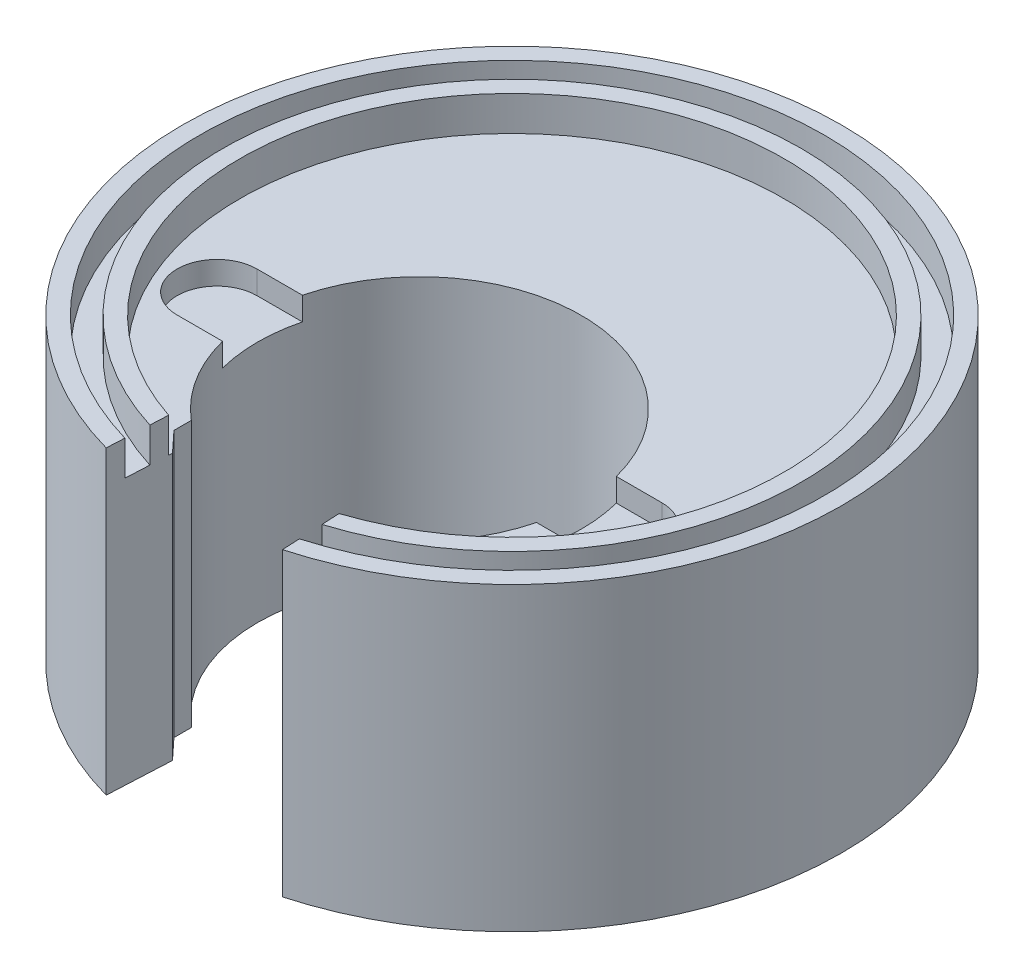
ISO-10303-21;
HEADER;
FILE_DESCRIPTION(('STEP AP214'),'2;1');
FILE_NAME('part.step','',(''),(''),'','','');
FILE_SCHEMA(('AUTOMOTIVE_DESIGN { 1 0 10303 214 1 1 1 1 }'));
ENDSEC;
DATA;
#1=APPLICATION_CONTEXT('core data for automotive mechanical design processes');
#2=APPLICATION_PROTOCOL_DEFINITION('international standard','automotive_design',2000,#1);
#3=PRODUCT_CONTEXT('',#1,'mechanical');
#4=PRODUCT('Part','Part','',(#3));
#5=PRODUCT_RELATED_PRODUCT_CATEGORY('part','',(#4));
#6=PRODUCT_DEFINITION_FORMATION('','',#4);
#7=PRODUCT_DEFINITION_CONTEXT('part definition',#1,'design');
#8=PRODUCT_DEFINITION('design','',#6,#7);
#9=PRODUCT_DEFINITION_SHAPE('','',#8);
#10=(LENGTH_UNIT() NAMED_UNIT(*) SI_UNIT(.MILLI.,.METRE.));
#11=(NAMED_UNIT(*) PLANE_ANGLE_UNIT() SI_UNIT($,.RADIAN.));
#12=(NAMED_UNIT(*) SI_UNIT($,.STERADIAN.) SOLID_ANGLE_UNIT());
#13=UNCERTAINTY_MEASURE_WITH_UNIT(LENGTH_MEASURE(1.E-05),#10,'distance_accuracy_value','');
#14=(GEOMETRIC_REPRESENTATION_CONTEXT(3) GLOBAL_UNCERTAINTY_ASSIGNED_CONTEXT((#13)) GLOBAL_UNIT_ASSIGNED_CONTEXT((#10,
#11,#12)) REPRESENTATION_CONTEXT('',''));
#15=CARTESIAN_POINT('',(0.,0.,0.));
#16=DIRECTION('',(0.,0.,1.));
#17=DIRECTION('',(1.,0.,0.));
#18=AXIS2_PLACEMENT_3D('',#15,#16,#17);
#19=CARTESIAN_POINT('',(0.,23.,0.));
#20=DIRECTION('',(0.,1.,0.));
#21=DIRECTION('',(0.,0.,1.));
#22=AXIS2_PLACEMENT_3D('',#19,#20,#21);
#23=PLANE('',#22);
#24=DIRECTION('',(1.,0.,0.));
#25=VECTOR('',#24,1.);
#26=CARTESIAN_POINT('',(-17.5,23.,11.45));
#27=LINE('',#26,#25);
#28=CARTESIAN_POINT('',(-17.5,23.,11.45));
#29=VERTEX_POINT('',#28);
#30=CARTESIAN_POINT('',(-13.5682533879641,23.,11.45));
#31=VERTEX_POINT('',#30);
#32=EDGE_CURVE('E401',#29,#31,#27,.T.);
#33=ORIENTED_EDGE('',*,*,#32,.F.);
#34=CARTESIAN_POINT('',(-17.5,23.,7.99999999999999));
#35=DIRECTION('',(0.,1.,0.));
#36=DIRECTION('',(0.,0.,1.));
#37=AXIS2_PLACEMENT_3D('',#34,#35,#36);
#38=CIRCLE('',#37,3.45);
#39=CARTESIAN_POINT('',(-17.5,23.,4.54999999999999));
#40=VERTEX_POINT('',#39);
#41=EDGE_CURVE('E404',#40,#29,#38,.T.);
#42=ORIENTED_EDGE('',*,*,#41,.F.);
#43=DIRECTION('',(-1.,0.,0.));
#44=VECTOR('',#43,1.);
#45=CARTESIAN_POINT('',(-13.5682533879641,23.,4.55));
#46=LINE('',#45,#44);
#47=CARTESIAN_POINT('',(-13.5682533879641,23.,4.55));
#48=VERTEX_POINT('',#47);
#49=EDGE_CURVE('E407',#48,#40,#46,.T.);
#50=ORIENTED_EDGE('',*,*,#49,.F.);
#51=CARTESIAN_POINT('',(0.,23.,8.));
#52=DIRECTION('',(0.,1.,0.));
#53=DIRECTION('',(0.,0.,1.));
#54=AXIS2_PLACEMENT_3D('',#51,#52,#53);
#55=CIRCLE('',#54,14.);
#56=CARTESIAN_POINT('',(13.5682533879641,23.,4.55));
#57=VERTEX_POINT('',#56);
#58=EDGE_CURVE('E347',#57,#48,#55,.T.);
#59=ORIENTED_EDGE('',*,*,#58,.F.);
#60=DIRECTION('',(-1.,0.,0.));
#61=VECTOR('',#60,1.);
#62=CARTESIAN_POINT('',(17.5,23.,4.55));
#63=LINE('',#62,#61);
#64=CARTESIAN_POINT('',(17.5,23.,4.55));
#65=VERTEX_POINT('',#64);
#66=EDGE_CURVE('E410',#65,#57,#63,.T.);
#67=ORIENTED_EDGE('',*,*,#66,.F.);
#68=CARTESIAN_POINT('',(17.5,23.,8.));
#69=DIRECTION('',(0.,1.,0.));
#70=DIRECTION('',(0.,0.,1.));
#71=AXIS2_PLACEMENT_3D('',#68,#69,#70);
#72=CIRCLE('',#71,3.45);
#73=CARTESIAN_POINT('',(17.5,23.,11.45));
#74=VERTEX_POINT('',#73);
#75=EDGE_CURVE('E412',#74,#65,#72,.T.);
#76=ORIENTED_EDGE('',*,*,#75,.F.);
#77=DIRECTION('',(1.,0.,0.));
#78=VECTOR('',#77,1.);
#79=CARTESIAN_POINT('',(13.5682533879641,23.,11.45));
#80=LINE('',#79,#78);
#81=CARTESIAN_POINT('',(13.5682533879641,23.,11.45));
#82=VERTEX_POINT('',#81);
#83=EDGE_CURVE('E415',#82,#74,#80,.T.);
#84=ORIENTED_EDGE('',*,*,#83,.F.);
#85=CARTESIAN_POINT('',(8.99999999999999,23.,18.7238052947636));
#86=VERTEX_POINT('',#85);
#87=EDGE_CURVE('E345',#86,#82,#55,.T.);
#88=ORIENTED_EDGE('',*,*,#87,.F.);
#89=DIRECTION('',(0.,0.,-1.));
#90=VECTOR('',#89,1.);
#91=CARTESIAN_POINT('',(8.99999999999999,23.,0.));
#92=LINE('',#91,#90);
#93=CARTESIAN_POINT('',(8.99999999999999,23.,20.2238052947636));
#94=VERTEX_POINT('',#93);
#95=EDGE_CURVE('E267',#94,#86,#92,.T.);
#96=ORIENTED_EDGE('',*,*,#95,.F.);
#97=DIRECTION('',(0.68060089492241,0.,-0.732654367236568));
#98=VECTOR('',#97,1.);
#99=CARTESIAN_POINT('',(14.9155455966769,23.,13.8558290720957));
#100=LINE('',#99,#98);
#101=CARTESIAN_POINT('',(7.34999999999999,23.,22.));
#102=VERTEX_POINT('',#101);
#103=EDGE_CURVE('E260',#102,#94,#100,.T.);
#104=ORIENTED_EDGE('',*,*,#103,.F.);
#105=DIRECTION('',(-0.048863968169108,0.,-0.998805442823961));
#106=VECTOR('',#105,1.);
#107=CARTESIAN_POINT('',(6.25872735568234,23.,-0.306192018159726));
#108=LINE('',#107,#106);
#109=CARTESIAN_POINT('',(7.36545532881279,23.,22.3159151235002));
#110=VERTEX_POINT('',#109);
#111=EDGE_CURVE('E350',#110,#102,#108,.T.);
#112=ORIENTED_EDGE('',*,*,#111,.F.);
#113=CARTESIAN_POINT('',(0.,23.,0.));
#114=DIRECTION('',(0.,1.,0.));
#115=DIRECTION('',(0.,0.,1.));
#116=AXIS2_PLACEMENT_3D('',#113,#114,#115);
#117=CIRCLE('',#116,23.5);
#118=CARTESIAN_POINT('',(-7.36545532881278,23.,22.3159151235002));
#119=VERTEX_POINT('',#118);
#120=EDGE_CURVE('E323',#110,#119,#117,.T.);
#121=ORIENTED_EDGE('',*,*,#120,.T.);
#122=DIRECTION('',(-0.048863968169108,0.,0.998805442823961));
#123=VECTOR('',#122,1.);
#124=CARTESIAN_POINT('',(-6.25872735568234,23.,-0.306192018159726));
#125=LINE('',#124,#123);
#126=CARTESIAN_POINT('',(-7.34999999999999,23.,22.));
#127=VERTEX_POINT('',#126);
#128=EDGE_CURVE('E354',#127,#119,#125,.T.);
#129=ORIENTED_EDGE('',*,*,#128,.F.);
#130=DIRECTION('',(0.680600894922409,0.,0.732654367236568));
#131=VECTOR('',#130,1.);
#132=CARTESIAN_POINT('',(-14.9155455966769,23.,13.8558290720957));
#133=LINE('',#132,#131);
#134=CARTESIAN_POINT('',(-8.99999999999999,23.,20.2238052947636));
#135=VERTEX_POINT('',#134);
#136=EDGE_CURVE('E278',#135,#127,#133,.T.);
#137=ORIENTED_EDGE('',*,*,#136,.F.);
#138=DIRECTION('',(0.,0.,1.));
#139=VECTOR('',#138,1.);
#140=CARTESIAN_POINT('',(-8.99999999999999,23.,0.));
#141=LINE('',#140,#139);
#142=CARTESIAN_POINT('',(-8.99999999999999,23.,18.7238052947636));
#143=VERTEX_POINT('',#142);
#144=EDGE_CURVE('E223',#143,#135,#141,.T.);
#145=ORIENTED_EDGE('',*,*,#144,.F.);
#146=EDGE_CURVE('E276',#31,#143,#55,.T.);
#147=ORIENTED_EDGE('',*,*,#146,.F.);
#148=EDGE_LOOP('',(#33,#42,#50,#59,#67,#76,#84,#88,#96,#104,#112,#121,#129,#137,#145,#147));
#149=FACE_BOUND('',#148,.T.);
#150=ADVANCED_FACE('F64',(#149),#23,.T.);
#151=CARTESIAN_POINT('',(0.,3.,0.));
#152=DIRECTION('',(0.,-1.,0.));
#153=DIRECTION('',(0.,0.,-1.));
#154=AXIS2_PLACEMENT_3D('',#151,#152,#153);
#155=CYLINDRICAL_SURFACE('',#154,28.5);
#156=DIRECTION('',(0.,-1.,0.));
#157=VECTOR('',#156,1.);
#158=CARTESIAN_POINT('',(7.61727272727272,23.,27.4631963944175));
#159=LINE('',#158,#157);
#160=CARTESIAN_POINT('',(7.61727272727272,26.,27.4631963944175));
#161=VERTEX_POINT('',#160);
#162=CARTESIAN_POINT('',(7.61727272727272,0.,27.4631963944175));
#163=VERTEX_POINT('',#162);
#164=EDGE_CURVE('E285',#161,#163,#159,.T.);
#165=ORIENTED_EDGE('',*,*,#164,.T.);
#166=CARTESIAN_POINT('',(0.,0.,0.));
#167=DIRECTION('',(0.,1.,0.));
#168=DIRECTION('',(0.,0.,1.));
#169=AXIS2_PLACEMENT_3D('',#166,#167,#168);
#170=CIRCLE('',#169,28.5);
#171=CARTESIAN_POINT('',(-7.61727272727272,0.,27.4631963944175));
#172=VERTEX_POINT('',#171);
#173=EDGE_CURVE('E237',#163,#172,#170,.T.);
#174=ORIENTED_EDGE('',*,*,#173,.T.);
#175=DIRECTION('',(0.,-1.,0.));
#176=VECTOR('',#175,1.);
#177=CARTESIAN_POINT('',(-7.61727272727272,23.,27.4631963944175));
#178=LINE('',#177,#176);
#179=CARTESIAN_POINT('',(-7.61727272727272,26.,27.4631963944175));
#180=VERTEX_POINT('',#179);
#181=EDGE_CURVE('E283',#180,#172,#178,.T.);
#182=ORIENTED_EDGE('',*,*,#181,.F.);
#183=CARTESIAN_POINT('',(0.,26.,0.));
#184=DIRECTION('',(0.,1.,0.));
#185=DIRECTION('',(0.,0.,1.));
#186=AXIS2_PLACEMENT_3D('',#183,#184,#185);
#187=CIRCLE('',#186,28.5);
#188=EDGE_CURVE('E304',#161,#180,#187,.T.);
#189=ORIENTED_EDGE('',*,*,#188,.F.);
#190=EDGE_LOOP('',(#165,#174,#182,#189));
#191=FACE_BOUND('',#190,.T.);
#192=ADVANCED_FACE('F66',(#191),#155,.T.);
#193=CARTESIAN_POINT('',(0.,0.,0.));
#194=DIRECTION('',(0.,1.,0.));
#195=DIRECTION('',(0.,0.,1.));
#196=AXIS2_PLACEMENT_3D('',#193,#194,#195);
#197=PLANE('',#196);
#198=ORIENTED_EDGE('',*,*,#173,.F.);
#199=DIRECTION('',(-0.0488639681691075,0.,-0.998805442823961));
#200=VECTOR('',#199,1.);
#201=CARTESIAN_POINT('',(6.25872735568235,0.,-0.306192018159723));
#202=LINE('',#201,#200);
#203=CARTESIAN_POINT('',(7.34999999999999,0.,22.));
#204=VERTEX_POINT('',#203);
#205=EDGE_CURVE('E12',#163,#204,#202,.T.);
#206=ORIENTED_EDGE('',*,*,#205,.T.);
#207=DIRECTION('',(0.68060089492241,0.,-0.732654367236567));
#208=VECTOR('',#207,1.);
#209=CARTESIAN_POINT('',(14.9155455966769,0.,13.8558290720957));
#210=LINE('',#209,#208);
#211=CARTESIAN_POINT('',(8.99999999999999,0.,20.2238052947636));
#212=VERTEX_POINT('',#211);
#213=EDGE_CURVE('E72',#204,#212,#210,.T.);
#214=ORIENTED_EDGE('',*,*,#213,.T.);
#215=DIRECTION('',(0.,0.,-1.));
#216=VECTOR('',#215,1.);
#217=CARTESIAN_POINT('',(8.99999999999999,0.,0.));
#218=LINE('',#217,#216);
#219=CARTESIAN_POINT('',(8.99999999999999,0.,18.7238052947636));
#220=VERTEX_POINT('',#219);
#221=EDGE_CURVE('E245',#212,#220,#218,.T.);
#222=ORIENTED_EDGE('',*,*,#221,.T.);
#223=CARTESIAN_POINT('',(0.,0.,8.));
#224=DIRECTION('',(0.,1.,0.));
#225=DIRECTION('',(0.,0.,1.));
#226=AXIS2_PLACEMENT_3D('',#223,#224,#225);
#227=CIRCLE('',#226,14.);
#228=CARTESIAN_POINT('',(-9.,0.,18.7238052947636));
#229=VERTEX_POINT('',#228);
#230=EDGE_CURVE('E243',#220,#229,#227,.T.);
#231=ORIENTED_EDGE('',*,*,#230,.T.);
#232=DIRECTION('',(0.,0.,1.));
#233=VECTOR('',#232,1.);
#234=CARTESIAN_POINT('',(-9.00000000000001,0.,0.));
#235=LINE('',#234,#233);
#236=CARTESIAN_POINT('',(-8.99999999999999,0.,20.2238052947636));
#237=VERTEX_POINT('',#236);
#238=EDGE_CURVE('E220',#229,#237,#235,.T.);
#239=ORIENTED_EDGE('',*,*,#238,.T.);
#240=DIRECTION('',(0.680600894922408,0.,0.732654367236569));
#241=VECTOR('',#240,1.);
#242=CARTESIAN_POINT('',(-14.9155455966769,0.,13.8558290720957));
#243=LINE('',#242,#241);
#244=CARTESIAN_POINT('',(-7.34999999999999,0.,22.));
#245=VERTEX_POINT('',#244);
#246=EDGE_CURVE('E231',#237,#245,#243,.T.);
#247=ORIENTED_EDGE('',*,*,#246,.T.);
#248=DIRECTION('',(-0.0488639681691076,0.,0.998805442823961));
#249=VECTOR('',#248,1.);
#250=CARTESIAN_POINT('',(-6.25872735568235,0.,-0.306192018159724));
#251=LINE('',#250,#249);
#252=EDGE_CURVE('E236',#245,#172,#251,.T.);
#253=ORIENTED_EDGE('',*,*,#252,.T.);
#254=EDGE_LOOP('',(#198,#206,#214,#222,#231,#239,#247,#253));
#255=FACE_BOUND('',#254,.T.);
#256=ADVANCED_FACE('F240',(#255),#197,.F.);
#257=CARTESIAN_POINT('',(0.,23.,8.));
#258=DIRECTION('',(0.,-1.,0.));
#259=DIRECTION('',(0.,0.,-1.));
#260=AXIS2_PLACEMENT_3D('',#257,#258,#259);
#261=CYLINDRICAL_SURFACE('',#260,14.);
#262=DIRECTION('',(0.,1.,0.));
#263=VECTOR('',#262,1.);
#264=CARTESIAN_POINT('',(13.5682533879641,21.,11.45));
#265=LINE('',#264,#263);
#266=CARTESIAN_POINT('',(13.5682533879641,21.,11.45));
#267=VERTEX_POINT('',#266);
#268=EDGE_CURVE('E385',#267,#82,#265,.T.);
#269=ORIENTED_EDGE('',*,*,#268,.F.);
#270=CARTESIAN_POINT('',(0.,21.,8.));
#271=DIRECTION('',(0.,1.,0.));
#272=DIRECTION('',(0.,0.,1.));
#273=AXIS2_PLACEMENT_3D('',#270,#271,#272);
#274=CIRCLE('',#273,14.);
#275=CARTESIAN_POINT('',(13.5682533879641,21.,4.55));
#276=VERTEX_POINT('',#275);
#277=EDGE_CURVE('E315',#267,#276,#274,.T.);
#278=ORIENTED_EDGE('',*,*,#277,.T.);
#279=DIRECTION('',(0.,1.,0.));
#280=VECTOR('',#279,1.);
#281=CARTESIAN_POINT('',(13.5682533879641,21.,4.55));
#282=LINE('',#281,#280);
#283=EDGE_CURVE('E391',#276,#57,#282,.T.);
#284=ORIENTED_EDGE('',*,*,#283,.T.);
#285=ORIENTED_EDGE('',*,*,#58,.T.);
#286=DIRECTION('',(0.,1.,0.));
#287=VECTOR('',#286,1.);
#288=CARTESIAN_POINT('',(-13.5682533879641,21.,4.55));
#289=LINE('',#288,#287);
#290=CARTESIAN_POINT('',(-13.5682533879641,21.,4.55));
#291=VERTEX_POINT('',#290);
#292=EDGE_CURVE('E394',#291,#48,#289,.T.);
#293=ORIENTED_EDGE('',*,*,#292,.F.);
#294=CARTESIAN_POINT('',(-13.5682533879641,21.,11.45));
#295=VERTEX_POINT('',#294);
#296=EDGE_CURVE('E381',#291,#295,#274,.T.);
#297=ORIENTED_EDGE('',*,*,#296,.T.);
#298=DIRECTION('',(0.,1.,0.));
#299=VECTOR('',#298,1.);
#300=CARTESIAN_POINT('',(-13.5682533879641,21.,11.45));
#301=LINE('',#300,#299);
#302=EDGE_CURVE('E384',#295,#31,#301,.T.);
#303=ORIENTED_EDGE('',*,*,#302,.T.);
#304=ORIENTED_EDGE('',*,*,#146,.T.);
#305=DIRECTION('',(0.,-1.,0.));
#306=VECTOR('',#305,1.);
#307=CARTESIAN_POINT('',(-8.99999999999999,23.,18.7238052947636));
#308=LINE('',#307,#306);
#309=EDGE_CURVE('E228',#143,#229,#308,.T.);
#310=ORIENTED_EDGE('',*,*,#309,.T.);
#311=ORIENTED_EDGE('',*,*,#230,.F.);
#312=DIRECTION('',(0.,-1.,0.));
#313=VECTOR('',#312,1.);
#314=CARTESIAN_POINT('',(8.99999999999999,23.,18.7238052947636));
#315=LINE('',#314,#313);
#316=EDGE_CURVE('E264',#86,#220,#315,.T.);
#317=ORIENTED_EDGE('',*,*,#316,.F.);
#318=ORIENTED_EDGE('',*,*,#87,.T.);
#319=EDGE_LOOP('',(#269,#278,#284,#285,#293,#297,#303,#304,#310,#311,#317,#318));
#320=FACE_BOUND('',#319,.T.);
#321=ADVANCED_FACE('F273',(#320),#261,.F.);
#322=CARTESIAN_POINT('',(8.99999999999999,23.,0.));
#323=DIRECTION('',(-1.,0.,0.));
#324=DIRECTION('',(0.,0.,1.));
#325=AXIS2_PLACEMENT_3D('',#322,#323,#324);
#326=PLANE('',#325);
#327=ORIENTED_EDGE('',*,*,#316,.T.);
#328=ORIENTED_EDGE('',*,*,#221,.F.);
#329=DIRECTION('',(0.,-1.,0.));
#330=VECTOR('',#329,1.);
#331=CARTESIAN_POINT('',(8.99999999999999,23.,20.2238052947636));
#332=LINE('',#331,#330);
#333=EDGE_CURVE('E259',#94,#212,#332,.T.);
#334=ORIENTED_EDGE('',*,*,#333,.F.);
#335=ORIENTED_EDGE('',*,*,#95,.T.);
#336=EDGE_LOOP('',(#327,#328,#334,#335));
#337=FACE_BOUND('',#336,.T.);
#338=ADVANCED_FACE('F266',(#337),#326,.T.);
#339=CARTESIAN_POINT('',(14.9155455966769,23.,13.8558290720957));
#340=DIRECTION('',(-0.732654367236568,0.,-0.68060089492241));
#341=DIRECTION('',(-0.68060089492241,0.,0.732654367236568));
#342=AXIS2_PLACEMENT_3D('',#339,#340,#341);
#343=PLANE('',#342);
#344=ORIENTED_EDGE('',*,*,#333,.T.);
#345=ORIENTED_EDGE('',*,*,#213,.F.);
#346=DIRECTION('',(0.,-1.,0.));
#347=VECTOR('',#346,1.);
#348=CARTESIAN_POINT('',(7.34999999999999,23.,22.));
#349=LINE('',#348,#347);
#350=EDGE_CURVE('E257',#102,#204,#349,.T.);
#351=ORIENTED_EDGE('',*,*,#350,.F.);
#352=ORIENTED_EDGE('',*,*,#103,.T.);
#353=EDGE_LOOP('',(#344,#345,#351,#352));
#354=FACE_BOUND('',#353,.T.);
#355=ADVANCED_FACE('F255',(#354),#343,.T.);
#356=CARTESIAN_POINT('',(6.25872735568234,23.,-0.306192018159726));
#357=DIRECTION('',(-0.998805442823961,0.,0.048863968169108));
#358=DIRECTION('',(0.048863968169108,0.,0.998805442823961));
#359=AXIS2_PLACEMENT_3D('',#356,#357,#358);
#360=PLANE('',#359);
#361=ORIENTED_EDGE('',*,*,#350,.T.);
#362=ORIENTED_EDGE('',*,*,#205,.F.);
#363=ORIENTED_EDGE('',*,*,#164,.F.);
#364=DIRECTION('',(0.048863968169108,0.,0.998805442823961));
#365=VECTOR('',#364,1.);
#366=CARTESIAN_POINT('',(6.25872735568234,26.,-0.306192018159726));
#367=LINE('',#366,#365);
#368=CARTESIAN_POINT('',(7.54203189936989,26.,25.9252339397138));
#369=VERTEX_POINT('',#368);
#370=EDGE_CURVE('E308',#369,#161,#367,.T.);
#371=ORIENTED_EDGE('',*,*,#370,.F.);
#372=DIRECTION('',(0.,-1.,0.));
#373=VECTOR('',#372,1.);
#374=CARTESIAN_POINT('',(7.54203189936989,26.,25.9252339397138));
#375=LINE('',#374,#373);
#376=CARTESIAN_POINT('',(7.54203189936989,23.,25.9252339397138));
#377=VERTEX_POINT('',#376);
#378=EDGE_CURVE('E306',#369,#377,#375,.T.);
#379=ORIENTED_EDGE('',*,*,#378,.T.);
#380=CARTESIAN_POINT('',(7.44133086649441,23.,23.8668513829403));
#381=VERTEX_POINT('',#380);
#382=EDGE_CURVE('E351',#377,#381,#108,.T.);
#383=ORIENTED_EDGE('',*,*,#382,.T.);
#384=DIRECTION('',(0.,-1.,0.));
#385=VECTOR('',#384,1.);
#386=CARTESIAN_POINT('',(7.4413308664944,26.,23.8668513829403));
#387=LINE('',#386,#385);
#388=CARTESIAN_POINT('',(7.4413308664944,26.,23.8668513829403));
#389=VERTEX_POINT('',#388);
#390=EDGE_CURVE('E342',#389,#381,#387,.T.);
#391=ORIENTED_EDGE('',*,*,#390,.F.);
#392=DIRECTION('',(0.048863968169108,0.,0.998805442823961));
#393=VECTOR('',#392,1.);
#394=CARTESIAN_POINT('',(6.25872735568234,26.,-0.306192018159726));
#395=LINE('',#394,#393);
#396=CARTESIAN_POINT('',(7.36545532881278,26.,22.3159151235002));
#397=VERTEX_POINT('',#396);
#398=EDGE_CURVE('E319',#397,#389,#395,.T.);
#399=ORIENTED_EDGE('',*,*,#398,.F.);
#400=DIRECTION('',(0.,-1.,0.));
#401=VECTOR('',#400,1.);
#402=CARTESIAN_POINT('',(7.36545532881278,26.,22.3159151235002));
#403=LINE('',#402,#401);
#404=EDGE_CURVE('E330',#397,#110,#403,.T.);
#405=ORIENTED_EDGE('',*,*,#404,.T.);
#406=ORIENTED_EDGE('',*,*,#111,.T.);
#407=EDGE_LOOP('',(#361,#362,#363,#371,#379,#383,#391,#399,#405,#406));
#408=FACE_BOUND('',#407,.T.);
#409=ADVANCED_FACE('F483',(#408),#360,.T.);
#410=CARTESIAN_POINT('',(-6.25872735568234,23.,-0.306192018159726));
#411=DIRECTION('',(0.998805442823961,0.,0.048863968169108));
#412=DIRECTION('',(0.048863968169108,0.,-0.998805442823961));
#413=AXIS2_PLACEMENT_3D('',#410,#411,#412);
#414=PLANE('',#413);
#415=ORIENTED_EDGE('',*,*,#181,.T.);
#416=ORIENTED_EDGE('',*,*,#252,.F.);
#417=DIRECTION('',(0.,-1.,0.));
#418=VECTOR('',#417,1.);
#419=CARTESIAN_POINT('',(-7.34999999999999,23.,22.));
#420=LINE('',#419,#418);
#421=EDGE_CURVE('E227',#127,#245,#420,.T.);
#422=ORIENTED_EDGE('',*,*,#421,.F.);
#423=ORIENTED_EDGE('',*,*,#128,.T.);
#424=DIRECTION('',(0.,-1.,0.));
#425=VECTOR('',#424,1.);
#426=CARTESIAN_POINT('',(-7.36545532881278,26.,22.3159151235002));
#427=LINE('',#426,#425);
#428=CARTESIAN_POINT('',(-7.36545532881278,26.,22.3159151235002));
#429=VERTEX_POINT('',#428);
#430=EDGE_CURVE('E336',#429,#119,#427,.T.);
#431=ORIENTED_EDGE('',*,*,#430,.F.);
#432=DIRECTION('',(0.048863968169108,0.,-0.998805442823961));
#433=VECTOR('',#432,1.);
#434=CARTESIAN_POINT('',(-6.25872735568234,26.,-0.306192018159726));
#435=LINE('',#434,#433);
#436=CARTESIAN_POINT('',(-7.4413308664944,26.,23.8668513829403));
#437=VERTEX_POINT('',#436);
#438=EDGE_CURVE('E325',#437,#429,#435,.T.);
#439=ORIENTED_EDGE('',*,*,#438,.F.);
#440=DIRECTION('',(0.,-1.,0.));
#441=VECTOR('',#440,1.);
#442=CARTESIAN_POINT('',(-7.4413308664944,26.,23.8668513829403));
#443=LINE('',#442,#441);
#444=CARTESIAN_POINT('',(-7.4413308664944,23.,23.8668513829403));
#445=VERTEX_POINT('',#444);
#446=EDGE_CURVE('E339',#437,#445,#443,.T.);
#447=ORIENTED_EDGE('',*,*,#446,.T.);
#448=CARTESIAN_POINT('',(-7.54203189936989,23.,25.9252339397138));
#449=VERTEX_POINT('',#448);
#450=EDGE_CURVE('E353',#445,#449,#125,.T.);
#451=ORIENTED_EDGE('',*,*,#450,.T.);
#452=DIRECTION('',(0.,-1.,0.));
#453=VECTOR('',#452,1.);
#454=CARTESIAN_POINT('',(-7.54203189936989,26.,25.9252339397138));
#455=LINE('',#454,#453);
#456=CARTESIAN_POINT('',(-7.54203189936989,26.,25.9252339397138));
#457=VERTEX_POINT('',#456);
#458=EDGE_CURVE('E300',#457,#449,#455,.T.);
#459=ORIENTED_EDGE('',*,*,#458,.F.);
#460=DIRECTION('',(0.048863968169108,0.,-0.998805442823961));
#461=VECTOR('',#460,1.);
#462=CARTESIAN_POINT('',(-6.25872735568234,26.,-0.306192018159726));
#463=LINE('',#462,#461);
#464=EDGE_CURVE('E298',#180,#457,#463,.T.);
#465=ORIENTED_EDGE('',*,*,#464,.F.);
#466=EDGE_LOOP('',(#415,#416,#422,#423,#431,#439,#447,#451,#459,#465));
#467=FACE_BOUND('',#466,.T.);
#468=ADVANCED_FACE('F293',(#467),#414,.T.);
#469=CARTESIAN_POINT('',(-14.9155455966769,23.,13.8558290720957));
#470=DIRECTION('',(0.732654367236568,0.,-0.680600894922409));
#471=DIRECTION('',(-0.680600894922409,0.,-0.732654367236568));
#472=AXIS2_PLACEMENT_3D('',#469,#470,#471);
#473=PLANE('',#472);
#474=ORIENTED_EDGE('',*,*,#421,.T.);
#475=ORIENTED_EDGE('',*,*,#246,.F.);
#476=DIRECTION('',(0.,-1.,0.));
#477=VECTOR('',#476,1.);
#478=CARTESIAN_POINT('',(-8.99999999999999,23.,20.2238052947636));
#479=LINE('',#478,#477);
#480=EDGE_CURVE('E215',#135,#237,#479,.T.);
#481=ORIENTED_EDGE('',*,*,#480,.F.);
#482=ORIENTED_EDGE('',*,*,#136,.T.);
#483=EDGE_LOOP('',(#474,#475,#481,#482));
#484=FACE_BOUND('',#483,.T.);
#485=ADVANCED_FACE('F232',(#484),#473,.T.);
#486=CARTESIAN_POINT('',(-8.99999999999999,23.,0.));
#487=DIRECTION('',(1.,0.,0.));
#488=DIRECTION('',(0.,0.,-1.));
#489=AXIS2_PLACEMENT_3D('',#486,#487,#488);
#490=PLANE('',#489);
#491=ORIENTED_EDGE('',*,*,#480,.T.);
#492=ORIENTED_EDGE('',*,*,#238,.F.);
#493=ORIENTED_EDGE('',*,*,#309,.F.);
#494=ORIENTED_EDGE('',*,*,#144,.T.);
#495=EDGE_LOOP('',(#491,#492,#493,#494));
#496=FACE_BOUND('',#495,.T.);
#497=ADVANCED_FACE('F217',(#496),#490,.T.);
#498=CARTESIAN_POINT('',(0.,23.,0.));
#499=DIRECTION('',(0.,1.,0.));
#500=DIRECTION('',(0.,0.,1.));
#501=AXIS2_PLACEMENT_3D('',#498,#499,#500);
#502=CIRCLE('',#501,27.);
#503=EDGE_CURVE('E312',#377,#449,#502,.T.);
#504=ORIENTED_EDGE('',*,*,#503,.T.);
#505=ORIENTED_EDGE('',*,*,#450,.F.);
#506=CARTESIAN_POINT('',(0.,23.,0.));
#507=DIRECTION('',(0.,1.,0.));
#508=DIRECTION('',(0.,0.,1.));
#509=AXIS2_PLACEMENT_3D('',#506,#507,#508);
#510=CIRCLE('',#509,25.);
#511=EDGE_CURVE('E318',#381,#445,#510,.T.);
#512=ORIENTED_EDGE('',*,*,#511,.F.);
#513=ORIENTED_EDGE('',*,*,#382,.F.);
#514=EDGE_LOOP('',(#504,#505,#512,#513));
#515=FACE_BOUND('',#514,.T.);
#516=ADVANCED_FACE('F373',(#515),#23,.T.);
#517=CARTESIAN_POINT('',(0.,26.,0.));
#518=DIRECTION('',(0.,-1.,0.));
#519=DIRECTION('',(0.,0.,-1.));
#520=AXIS2_PLACEMENT_3D('',#517,#518,#519);
#521=CYLINDRICAL_SURFACE('',#520,25.);
#522=ORIENTED_EDGE('',*,*,#511,.T.);
#523=ORIENTED_EDGE('',*,*,#446,.F.);
#524=CARTESIAN_POINT('',(0.,26.,0.));
#525=DIRECTION('',(0.,1.,0.));
#526=DIRECTION('',(0.,0.,1.));
#527=AXIS2_PLACEMENT_3D('',#524,#525,#526);
#528=CIRCLE('',#527,25.);
#529=EDGE_CURVE('E322',#389,#437,#528,.T.);
#530=ORIENTED_EDGE('',*,*,#529,.F.);
#531=ORIENTED_EDGE('',*,*,#390,.T.);
#532=EDGE_LOOP('',(#522,#523,#530,#531));
#533=FACE_BOUND('',#532,.T.);
#534=ADVANCED_FACE('F369',(#533),#521,.T.);
#535=CARTESIAN_POINT('',(0.,26.,0.));
#536=DIRECTION('',(0.,-1.,0.));
#537=DIRECTION('',(0.,0.,-1.));
#538=AXIS2_PLACEMENT_3D('',#535,#536,#537);
#539=CYLINDRICAL_SURFACE('',#538,23.5);
#540=ORIENTED_EDGE('',*,*,#120,.F.);
#541=ORIENTED_EDGE('',*,*,#404,.F.);
#542=CARTESIAN_POINT('',(0.,26.,0.));
#543=DIRECTION('',(0.,1.,0.));
#544=DIRECTION('',(0.,0.,1.));
#545=AXIS2_PLACEMENT_3D('',#542,#543,#544);
#546=CIRCLE('',#545,23.5);
#547=EDGE_CURVE('E327',#397,#429,#546,.T.);
#548=ORIENTED_EDGE('',*,*,#547,.T.);
#549=ORIENTED_EDGE('',*,*,#430,.T.);
#550=EDGE_LOOP('',(#540,#541,#548,#549));
#551=FACE_BOUND('',#550,.T.);
#552=ADVANCED_FACE('F361',(#551),#539,.F.);
#553=CARTESIAN_POINT('',(0.,26.,0.));
#554=DIRECTION('',(0.,1.,0.));
#555=DIRECTION('',(0.,0.,1.));
#556=AXIS2_PLACEMENT_3D('',#553,#554,#555);
#557=PLANE('',#556);
#558=ORIENTED_EDGE('',*,*,#398,.T.);
#559=ORIENTED_EDGE('',*,*,#529,.T.);
#560=ORIENTED_EDGE('',*,*,#438,.T.);
#561=ORIENTED_EDGE('',*,*,#547,.F.);
#562=EDGE_LOOP('',(#558,#559,#560,#561));
#563=FACE_BOUND('',#562,.T.);
#564=ADVANCED_FACE('F365',(#563),#557,.T.);
#565=CARTESIAN_POINT('',(0.,26.,0.));
#566=DIRECTION('',(0.,-1.,0.));
#567=DIRECTION('',(0.,0.,-1.));
#568=AXIS2_PLACEMENT_3D('',#565,#566,#567);
#569=CYLINDRICAL_SURFACE('',#568,27.);
#570=ORIENTED_EDGE('',*,*,#503,.F.);
#571=ORIENTED_EDGE('',*,*,#378,.F.);
#572=CARTESIAN_POINT('',(0.,26.,0.));
#573=DIRECTION('',(0.,1.,0.));
#574=DIRECTION('',(0.,0.,1.));
#575=AXIS2_PLACEMENT_3D('',#572,#573,#574);
#576=CIRCLE('',#575,27.);
#577=EDGE_CURVE('E314',#369,#457,#576,.T.);
#578=ORIENTED_EDGE('',*,*,#577,.T.);
#579=ORIENTED_EDGE('',*,*,#458,.T.);
#580=EDGE_LOOP('',(#570,#571,#578,#579));
#581=FACE_BOUND('',#580,.T.);
#582=ADVANCED_FACE('F376',(#581),#569,.F.);
#583=CARTESIAN_POINT('',(0.,26.,0.));
#584=DIRECTION('',(0.,1.,0.));
#585=DIRECTION('',(0.,0.,1.));
#586=AXIS2_PLACEMENT_3D('',#583,#584,#585);
#587=PLANE('',#586);
#588=ORIENTED_EDGE('',*,*,#577,.F.);
#589=ORIENTED_EDGE('',*,*,#370,.T.);
#590=ORIENTED_EDGE('',*,*,#188,.T.);
#591=ORIENTED_EDGE('',*,*,#464,.T.);
#592=EDGE_LOOP('',(#588,#589,#590,#591));
#593=FACE_BOUND('',#592,.T.);
#594=ADVANCED_FACE('F622',(#593),#587,.T.);
#595=CARTESIAN_POINT('',(0.,21.,8.));
#596=DIRECTION('',(0.,1.,0.));
#597=DIRECTION('',(0.,0.,1.));
#598=AXIS2_PLACEMENT_3D('',#595,#596,#597);
#599=PLANE('',#598);
#600=DIRECTION('',(-1.,0.,0.));
#601=VECTOR('',#600,1.);
#602=CARTESIAN_POINT('',(-13.5682533879641,21.,4.55));
#603=LINE('',#602,#601);
#604=CARTESIAN_POINT('',(-17.5,21.,4.54999999999999));
#605=VERTEX_POINT('',#604);
#606=EDGE_CURVE('E421',#291,#605,#603,.T.);
#607=ORIENTED_EDGE('',*,*,#606,.T.);
#608=CARTESIAN_POINT('',(-17.5,21.,7.99999999999999));
#609=DIRECTION('',(0.,1.,0.));
#610=DIRECTION('',(0.,0.,1.));
#611=AXIS2_PLACEMENT_3D('',#608,#609,#610);
#612=CIRCLE('',#611,3.45);
#613=CARTESIAN_POINT('',(-17.5,21.,11.45));
#614=VERTEX_POINT('',#613);
#615=EDGE_CURVE('E419',#605,#614,#612,.T.);
#616=ORIENTED_EDGE('',*,*,#615,.T.);
#617=DIRECTION('',(1.,0.,0.));
#618=VECTOR('',#617,1.);
#619=CARTESIAN_POINT('',(-17.5,21.,11.45));
#620=LINE('',#619,#618);
#621=EDGE_CURVE('E87',#614,#295,#620,.T.);
#622=ORIENTED_EDGE('',*,*,#621,.T.);
#623=ORIENTED_EDGE('',*,*,#296,.F.);
#624=EDGE_LOOP('',(#607,#616,#622,#623));
#625=FACE_BOUND('',#624,.T.);
#626=ADVANCED_FACE('F450',(#625),#599,.T.);
#627=CARTESIAN_POINT('',(-13.5682533879641,21.,4.55));
#628=DIRECTION('',(0.,0.,-1.));
#629=DIRECTION('',(-1.,0.,0.));
#630=AXIS2_PLACEMENT_3D('',#627,#628,#629);
#631=PLANE('',#630);
#632=ORIENTED_EDGE('',*,*,#49,.T.);
#633=DIRECTION('',(0.,1.,0.));
#634=VECTOR('',#633,1.);
#635=CARTESIAN_POINT('',(-17.5,21.,4.54999999999999));
#636=LINE('',#635,#634);
#637=EDGE_CURVE('E396',#605,#40,#636,.T.);
#638=ORIENTED_EDGE('',*,*,#637,.F.);
#639=ORIENTED_EDGE('',*,*,#606,.F.);
#640=ORIENTED_EDGE('',*,*,#292,.T.);
#641=EDGE_LOOP('',(#632,#638,#639,#640));
#642=FACE_BOUND('',#641,.T.);
#643=ADVANCED_FACE('F447',(#642),#631,.F.);
#644=CARTESIAN_POINT('',(-17.5,21.,11.45));
#645=DIRECTION('',(0.,0.,1.));
#646=DIRECTION('',(1.,0.,0.));
#647=AXIS2_PLACEMENT_3D('',#644,#645,#646);
#648=PLANE('',#647);
#649=ORIENTED_EDGE('',*,*,#32,.T.);
#650=ORIENTED_EDGE('',*,*,#302,.F.);
#651=ORIENTED_EDGE('',*,*,#621,.F.);
#652=DIRECTION('',(0.,1.,0.));
#653=VECTOR('',#652,1.);
#654=CARTESIAN_POINT('',(-17.5,21.,11.45));
#655=LINE('',#654,#653);
#656=EDGE_CURVE('E398',#614,#29,#655,.T.);
#657=ORIENTED_EDGE('',*,*,#656,.T.);
#658=EDGE_LOOP('',(#649,#650,#651,#657));
#659=FACE_BOUND('',#658,.T.);
#660=ADVANCED_FACE('F454',(#659),#648,.F.);
#661=CARTESIAN_POINT('',(-17.5,21.,7.99999999999999));
#662=DIRECTION('',(0.,1.,0.));
#663=DIRECTION('',(0.,0.,1.));
#664=AXIS2_PLACEMENT_3D('',#661,#662,#663);
#665=CYLINDRICAL_SURFACE('',#664,3.45);
#666=ORIENTED_EDGE('',*,*,#41,.T.);
#667=ORIENTED_EDGE('',*,*,#656,.F.);
#668=ORIENTED_EDGE('',*,*,#615,.F.);
#669=ORIENTED_EDGE('',*,*,#637,.T.);
#670=EDGE_LOOP('',(#666,#667,#668,#669));
#671=FACE_BOUND('',#670,.T.);
#672=ADVANCED_FACE('F452',(#671),#665,.F.);
#673=DIRECTION('',(1.,0.,0.));
#674=VECTOR('',#673,1.);
#675=CARTESIAN_POINT('',(13.5682533879641,21.,11.45));
#676=LINE('',#675,#674);
#677=CARTESIAN_POINT('',(17.5,21.,11.45));
#678=VERTEX_POINT('',#677);
#679=EDGE_CURVE('E403',#267,#678,#676,.T.);
#680=ORIENTED_EDGE('',*,*,#679,.T.);
#681=CARTESIAN_POINT('',(17.5,21.,8.));
#682=DIRECTION('',(0.,1.,0.));
#683=DIRECTION('',(0.,0.,1.));
#684=AXIS2_PLACEMENT_3D('',#681,#682,#683);
#685=CIRCLE('',#684,3.45);
#686=CARTESIAN_POINT('',(17.5,21.,4.55));
#687=VERTEX_POINT('',#686);
#688=EDGE_CURVE('E425',#678,#687,#685,.T.);
#689=ORIENTED_EDGE('',*,*,#688,.T.);
#690=DIRECTION('',(-1.,0.,0.));
#691=VECTOR('',#690,1.);
#692=CARTESIAN_POINT('',(17.5,21.,4.55));
#693=LINE('',#692,#691);
#694=EDGE_CURVE('E79',#687,#276,#693,.T.);
#695=ORIENTED_EDGE('',*,*,#694,.T.);
#696=ORIENTED_EDGE('',*,*,#277,.F.);
#697=EDGE_LOOP('',(#680,#689,#695,#696));
#698=FACE_BOUND('',#697,.T.);
#699=ADVANCED_FACE('F429',(#698),#599,.T.);
#700=CARTESIAN_POINT('',(17.5,21.,4.55));
#701=DIRECTION('',(0.,0.,-1.));
#702=DIRECTION('',(-1.,0.,0.));
#703=AXIS2_PLACEMENT_3D('',#700,#701,#702);
#704=PLANE('',#703);
#705=ORIENTED_EDGE('',*,*,#66,.T.);
#706=ORIENTED_EDGE('',*,*,#283,.F.);
#707=ORIENTED_EDGE('',*,*,#694,.F.);
#708=DIRECTION('',(0.,1.,0.));
#709=VECTOR('',#708,1.);
#710=CARTESIAN_POINT('',(17.5,21.,4.55));
#711=LINE('',#710,#709);
#712=EDGE_CURVE('E389',#687,#65,#711,.T.);
#713=ORIENTED_EDGE('',*,*,#712,.T.);
#714=EDGE_LOOP('',(#705,#706,#707,#713));
#715=FACE_BOUND('',#714,.T.);
#716=ADVANCED_FACE('F441',(#715),#704,.F.);
#717=CARTESIAN_POINT('',(17.5,21.,8.));
#718=DIRECTION('',(0.,1.,0.));
#719=DIRECTION('',(0.,0.,1.));
#720=AXIS2_PLACEMENT_3D('',#717,#718,#719);
#721=CYLINDRICAL_SURFACE('',#720,3.45);
#722=ORIENTED_EDGE('',*,*,#75,.T.);
#723=ORIENTED_EDGE('',*,*,#712,.F.);
#724=ORIENTED_EDGE('',*,*,#688,.F.);
#725=DIRECTION('',(0.,1.,0.));
#726=VECTOR('',#725,1.);
#727=CARTESIAN_POINT('',(17.5,21.,11.45));
#728=LINE('',#727,#726);
#729=EDGE_CURVE('E387',#678,#74,#728,.T.);
#730=ORIENTED_EDGE('',*,*,#729,.T.);
#731=EDGE_LOOP('',(#722,#723,#724,#730));
#732=FACE_BOUND('',#731,.T.);
#733=ADVANCED_FACE('F439',(#732),#721,.F.);
#734=CARTESIAN_POINT('',(13.5682533879641,21.,11.45));
#735=DIRECTION('',(0.,0.,1.));
#736=DIRECTION('',(1.,0.,0.));
#737=AXIS2_PLACEMENT_3D('',#734,#735,#736);
#738=PLANE('',#737);
#739=ORIENTED_EDGE('',*,*,#83,.T.);
#740=ORIENTED_EDGE('',*,*,#729,.F.);
#741=ORIENTED_EDGE('',*,*,#679,.F.);
#742=ORIENTED_EDGE('',*,*,#268,.T.);
#743=EDGE_LOOP('',(#739,#740,#741,#742));
#744=FACE_BOUND('',#743,.T.);
#745=ADVANCED_FACE('F433',(#744),#738,.F.);
#746=CLOSED_SHELL('',(#150,#192,#256,#321,#338,#355,#409,#468,#485,#497,#516,#534,#552,#564,
#582,#594,#626,#643,#660,#672,#699,#716,#733,#745));
#747=MANIFOLD_SOLID_BREP('B2',#746);
#748=ADVANCED_BREP_SHAPE_REPRESENTATION('',(#18,#747),#14);
#749=SHAPE_DEFINITION_REPRESENTATION(#9,#748);
ENDSEC;
END-ISO-10303-21;
